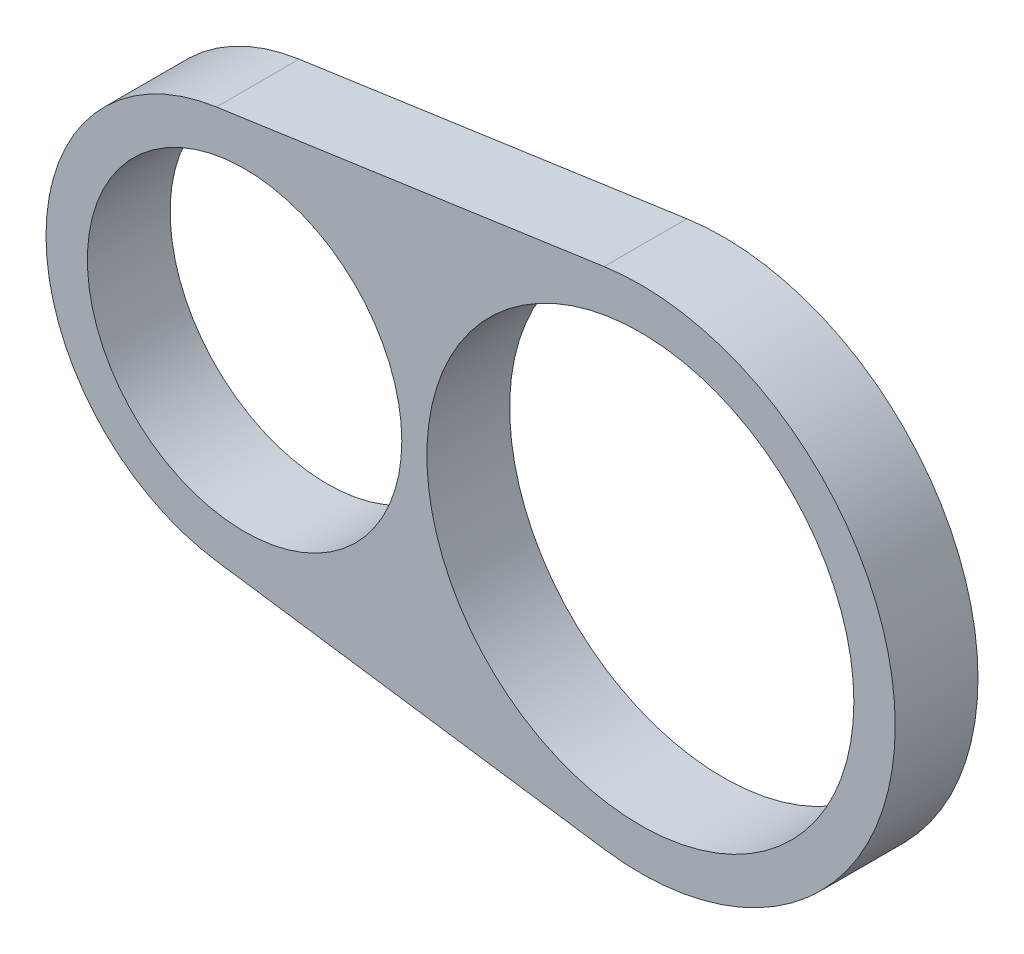
ISO-10303-21;
HEADER;
FILE_DESCRIPTION(('STEP AP214'),'2;1');
FILE_NAME('part.step','',(''),(''),'','','');
FILE_SCHEMA(('AUTOMOTIVE_DESIGN { 1 0 10303 214 1 1 1 1 }'));
ENDSEC;
DATA;
#1=APPLICATION_CONTEXT('core data for automotive mechanical design processes');
#2=APPLICATION_PROTOCOL_DEFINITION('international standard','automotive_design',2000,#1);
#3=PRODUCT_CONTEXT('',#1,'mechanical');
#4=PRODUCT('Part','Part','',(#3));
#5=PRODUCT_RELATED_PRODUCT_CATEGORY('part','',(#4));
#6=PRODUCT_DEFINITION_FORMATION('','',#4);
#7=PRODUCT_DEFINITION_CONTEXT('part definition',#1,'design');
#8=PRODUCT_DEFINITION('design','',#6,#7);
#9=PRODUCT_DEFINITION_SHAPE('','',#8);
#10=(LENGTH_UNIT() NAMED_UNIT(*) SI_UNIT(.MILLI.,.METRE.));
#11=(NAMED_UNIT(*) PLANE_ANGLE_UNIT() SI_UNIT($,.RADIAN.));
#12=(NAMED_UNIT(*) SI_UNIT($,.STERADIAN.) SOLID_ANGLE_UNIT());
#13=UNCERTAINTY_MEASURE_WITH_UNIT(LENGTH_MEASURE(1.E-05),#10,'distance_accuracy_value','');
#14=(GEOMETRIC_REPRESENTATION_CONTEXT(3) GLOBAL_UNCERTAINTY_ASSIGNED_CONTEXT((#13)) GLOBAL_UNIT_ASSIGNED_CONTEXT((#10,
#11,#12)) REPRESENTATION_CONTEXT('',''));
#15=CARTESIAN_POINT('',(0.,0.,0.));
#16=DIRECTION('',(0.,0.,1.));
#17=DIRECTION('',(1.,0.,0.));
#18=AXIS2_PLACEMENT_3D('',#15,#16,#17);
#19=CARTESIAN_POINT('',(-23.915,0.,10.));
#20=DIRECTION('',(0.,0.,1.));
#21=DIRECTION('',(1.,0.,0.));
#22=AXIS2_PLACEMENT_3D('',#19,#20,#21);
#23=PLANE('',#22);
#24=CARTESIAN_POINT('',(23.915,0.,10.));
#25=DIRECTION('',(0.,0.,1.));
#26=DIRECTION('',(1.,0.,0.));
#27=AXIS2_PLACEMENT_3D('',#24,#25,#26);
#28=CIRCLE('',#27,25.8);
#29=CARTESIAN_POINT('',(49.715,0.,10.));
#30=VERTEX_POINT('',#29);
#31=EDGE_CURVE('E101',#30,#30,#28,.T.);
#32=ORIENTED_EDGE('',*,*,#31,.F.);
#33=EDGE_LOOP('',(#32));
#34=FACE_BOUND('',#33,.T.);
#35=CARTESIAN_POINT('',(-23.915,0.,10.));
#36=DIRECTION('',(0.,0.,1.));
#37=DIRECTION('',(1.,0.,0.));
#38=AXIS2_PLACEMENT_3D('',#35,#36,#37);
#39=CIRCLE('',#38,24.);
#40=CARTESIAN_POINT('',(-27.3270844658164,23.7562134945394,10.));
#41=VERTEX_POINT('',#40);
#42=CARTESIAN_POINT('',(-27.3270844658164,-23.7562134945394,10.));
#43=VERTEX_POINT('',#42);
#44=EDGE_CURVE('E86',#41,#43,#39,.T.);
#45=ORIENTED_EDGE('',*,*,#44,.T.);
#46=DIRECTION('',(0.98984222893914,-0.142170186075684,0.));
#47=VECTOR('',#46,1.);
#48=CARTESIAN_POINT('',(-27.3270844658164,-23.7562134945394,10.));
#49=LINE('',#48,#47);
#50=CARTESIAN_POINT('',(19.5361582688689,-30.4871406513255,10.));
#51=VERTEX_POINT('',#50);
#52=EDGE_CURVE('E81',#43,#51,#49,.T.);
#53=ORIENTED_EDGE('',*,*,#52,.T.);
#54=CARTESIAN_POINT('',(23.915,0.,10.));
#55=DIRECTION('',(0.,0.,1.));
#56=DIRECTION('',(1.,0.,0.));
#57=AXIS2_PLACEMENT_3D('',#54,#55,#56);
#58=CIRCLE('',#57,30.8);
#59=CARTESIAN_POINT('',(19.5361582688689,30.4871406513255,10.));
#60=VERTEX_POINT('',#59);
#61=EDGE_CURVE('E84',#51,#60,#58,.T.);
#62=ORIENTED_EDGE('',*,*,#61,.T.);
#63=DIRECTION('',(-0.98984222893914,-0.142170186075685,0.));
#64=VECTOR('',#63,1.);
#65=CARTESIAN_POINT('',(19.5361582688689,30.4871406513255,10.));
#66=LINE('',#65,#64);
#67=EDGE_CURVE('E51',#60,#41,#66,.T.);
#68=ORIENTED_EDGE('',*,*,#67,.T.);
#69=EDGE_LOOP('',(#45,#53,#62,#68));
#70=FACE_BOUND('',#69,.T.);
#71=CARTESIAN_POINT('',(-23.915,0.,10.));
#72=DIRECTION('',(0.,0.,1.));
#73=DIRECTION('',(1.,0.,0.));
#74=AXIS2_PLACEMENT_3D('',#71,#72,#73);
#75=CIRCLE('',#74,19.);
#76=CARTESIAN_POINT('',(-4.915,0.,10.));
#77=VERTEX_POINT('',#76);
#78=EDGE_CURVE('E116',#77,#77,#75,.T.);
#79=ORIENTED_EDGE('',*,*,#78,.F.);
#80=EDGE_LOOP('',(#79));
#81=FACE_BOUND('',#80,.T.);
#82=ADVANCED_FACE('F34',(#34,#70,#81),#23,.T.);
#83=CARTESIAN_POINT('',(-23.915,0.,0.));
#84=DIRECTION('',(0.,0.,1.));
#85=DIRECTION('',(1.,0.,0.));
#86=AXIS2_PLACEMENT_3D('',#83,#84,#85);
#87=PLANE('',#86);
#88=CARTESIAN_POINT('',(-23.915,0.,0.));
#89=DIRECTION('',(0.,0.,1.));
#90=DIRECTION('',(1.,0.,0.));
#91=AXIS2_PLACEMENT_3D('',#88,#89,#90);
#92=CIRCLE('',#91,24.);
#93=CARTESIAN_POINT('',(-27.3270844658164,23.7562134945394,0.));
#94=VERTEX_POINT('',#93);
#95=CARTESIAN_POINT('',(-27.3270844658164,-23.7562134945394,0.));
#96=VERTEX_POINT('',#95);
#97=EDGE_CURVE('E98',#94,#96,#92,.T.);
#98=ORIENTED_EDGE('',*,*,#97,.F.);
#99=DIRECTION('',(-0.98984222893914,-0.142170186075685,0.));
#100=VECTOR('',#99,1.);
#101=CARTESIAN_POINT('',(19.5361582688689,30.4871406513255,0.));
#102=LINE('',#101,#100);
#103=CARTESIAN_POINT('',(19.5361582688689,30.4871406513255,0.));
#104=VERTEX_POINT('',#103);
#105=EDGE_CURVE('E74',#104,#94,#102,.T.);
#106=ORIENTED_EDGE('',*,*,#105,.F.);
#107=CARTESIAN_POINT('',(23.915,0.,0.));
#108=DIRECTION('',(0.,0.,1.));
#109=DIRECTION('',(1.,0.,0.));
#110=AXIS2_PLACEMENT_3D('',#107,#108,#109);
#111=CIRCLE('',#110,30.8);
#112=CARTESIAN_POINT('',(19.5361582688689,-30.4871406513255,0.));
#113=VERTEX_POINT('',#112);
#114=EDGE_CURVE('E68',#113,#104,#111,.T.);
#115=ORIENTED_EDGE('',*,*,#114,.F.);
#116=DIRECTION('',(0.98984222893914,-0.142170186075684,0.));
#117=VECTOR('',#116,1.);
#118=CARTESIAN_POINT('',(-27.3270844658164,-23.7562134945394,0.));
#119=LINE('',#118,#117);
#120=EDGE_CURVE('E90',#96,#113,#119,.T.);
#121=ORIENTED_EDGE('',*,*,#120,.F.);
#122=EDGE_LOOP('',(#98,#106,#115,#121));
#123=FACE_BOUND('',#122,.T.);
#124=CARTESIAN_POINT('',(23.915,0.,0.));
#125=DIRECTION('',(0.,0.,1.));
#126=DIRECTION('',(1.,0.,0.));
#127=AXIS2_PLACEMENT_3D('',#124,#125,#126);
#128=CIRCLE('',#127,25.8);
#129=CARTESIAN_POINT('',(49.715,0.,0.));
#130=VERTEX_POINT('',#129);
#131=EDGE_CURVE('E113',#130,#130,#128,.T.);
#132=ORIENTED_EDGE('',*,*,#131,.T.);
#133=EDGE_LOOP('',(#132));
#134=FACE_BOUND('',#133,.T.);
#135=CARTESIAN_POINT('',(-23.915,0.,0.));
#136=DIRECTION('',(0.,0.,1.));
#137=DIRECTION('',(1.,0.,0.));
#138=AXIS2_PLACEMENT_3D('',#135,#136,#137);
#139=CIRCLE('',#138,19.);
#140=CARTESIAN_POINT('',(-4.915,0.,0.));
#141=VERTEX_POINT('',#140);
#142=EDGE_CURVE('E119',#141,#141,#139,.T.);
#143=ORIENTED_EDGE('',*,*,#142,.T.);
#144=EDGE_LOOP('',(#143));
#145=FACE_BOUND('',#144,.T.);
#146=ADVANCED_FACE('F109',(#123,#134,#145),#87,.F.);
#147=CARTESIAN_POINT('',(-23.915,0.,10.));
#148=DIRECTION('',(0.,0.,-1.));
#149=DIRECTION('',(-1.,0.,0.));
#150=AXIS2_PLACEMENT_3D('',#147,#148,#149);
#151=CYLINDRICAL_SURFACE('',#150,24.);
#152=ORIENTED_EDGE('',*,*,#97,.T.);
#153=DIRECTION('',(0.,0.,-1.));
#154=VECTOR('',#153,1.);
#155=CARTESIAN_POINT('',(-27.3270844658164,-23.7562134945394,10.));
#156=LINE('',#155,#154);
#157=EDGE_CURVE('E11',#43,#96,#156,.T.);
#158=ORIENTED_EDGE('',*,*,#157,.F.);
#159=ORIENTED_EDGE('',*,*,#44,.F.);
#160=DIRECTION('',(0.,0.,-1.));
#161=VECTOR('',#160,1.);
#162=CARTESIAN_POINT('',(-27.3270844658164,23.7562134945394,10.));
#163=LINE('',#162,#161);
#164=EDGE_CURVE('E94',#41,#94,#163,.T.);
#165=ORIENTED_EDGE('',*,*,#164,.T.);
#166=EDGE_LOOP('',(#152,#158,#159,#165));
#167=FACE_BOUND('',#166,.T.);
#168=ADVANCED_FACE('F36',(#167),#151,.T.);
#169=CARTESIAN_POINT('',(-27.3270844658164,-23.7562134945394,10.));
#170=DIRECTION('',(0.142170186075684,0.98984222893914,0.));
#171=DIRECTION('',(-0.98984222893914,0.142170186075684,0.));
#172=AXIS2_PLACEMENT_3D('',#169,#170,#171);
#173=PLANE('',#172);
#174=ORIENTED_EDGE('',*,*,#120,.T.);
#175=DIRECTION('',(0.,0.,-1.));
#176=VECTOR('',#175,1.);
#177=CARTESIAN_POINT('',(19.5361582688689,-30.4871406513255,10.));
#178=LINE('',#177,#176);
#179=EDGE_CURVE('E43',#51,#113,#178,.T.);
#180=ORIENTED_EDGE('',*,*,#179,.F.);
#181=ORIENTED_EDGE('',*,*,#52,.F.);
#182=ORIENTED_EDGE('',*,*,#157,.T.);
#183=EDGE_LOOP('',(#174,#180,#181,#182));
#184=FACE_BOUND('',#183,.T.);
#185=ADVANCED_FACE('F89',(#184),#173,.F.);
#186=CARTESIAN_POINT('',(23.915,0.,10.));
#187=DIRECTION('',(0.,0.,-1.));
#188=DIRECTION('',(-1.,0.,0.));
#189=AXIS2_PLACEMENT_3D('',#186,#187,#188);
#190=CYLINDRICAL_SURFACE('',#189,30.8);
#191=ORIENTED_EDGE('',*,*,#114,.T.);
#192=DIRECTION('',(0.,0.,-1.));
#193=VECTOR('',#192,1.);
#194=CARTESIAN_POINT('',(19.5361582688689,30.4871406513255,10.));
#195=LINE('',#194,#193);
#196=EDGE_CURVE('E91',#60,#104,#195,.T.);
#197=ORIENTED_EDGE('',*,*,#196,.F.);
#198=ORIENTED_EDGE('',*,*,#61,.F.);
#199=ORIENTED_EDGE('',*,*,#179,.T.);
#200=EDGE_LOOP('',(#191,#197,#198,#199));
#201=FACE_BOUND('',#200,.T.);
#202=ADVANCED_FACE('F92',(#201),#190,.T.);
#203=CARTESIAN_POINT('',(19.5361582688689,30.4871406513255,10.));
#204=DIRECTION('',(0.142170186075685,-0.98984222893914,0.));
#205=DIRECTION('',(0.98984222893914,0.142170186075685,0.));
#206=AXIS2_PLACEMENT_3D('',#203,#204,#205);
#207=PLANE('',#206);
#208=ORIENTED_EDGE('',*,*,#105,.T.);
#209=ORIENTED_EDGE('',*,*,#164,.F.);
#210=ORIENTED_EDGE('',*,*,#67,.F.);
#211=ORIENTED_EDGE('',*,*,#196,.T.);
#212=EDGE_LOOP('',(#208,#209,#210,#211));
#213=FACE_BOUND('',#212,.T.);
#214=ADVANCED_FACE('F106',(#213),#207,.F.);
#215=CARTESIAN_POINT('',(23.915,0.,10.));
#216=DIRECTION('',(0.,0.,-1.));
#217=DIRECTION('',(-1.,0.,0.));
#218=AXIS2_PLACEMENT_3D('',#215,#216,#217);
#219=CYLINDRICAL_SURFACE('',#218,25.8);
#220=ORIENTED_EDGE('',*,*,#31,.T.);
#221=EDGE_LOOP('',(#220));
#222=FACE_BOUND('',#221,.T.);
#223=ORIENTED_EDGE('',*,*,#131,.F.);
#224=EDGE_LOOP('',(#223));
#225=FACE_BOUND('',#224,.T.);
#226=ADVANCED_FACE('F136',(#222,#225),#219,.F.);
#227=CARTESIAN_POINT('',(-23.915,0.,10.));
#228=DIRECTION('',(0.,0.,-1.));
#229=DIRECTION('',(-1.,0.,0.));
#230=AXIS2_PLACEMENT_3D('',#227,#228,#229);
#231=CYLINDRICAL_SURFACE('',#230,19.);
#232=ORIENTED_EDGE('',*,*,#78,.T.);
#233=EDGE_LOOP('',(#232));
#234=FACE_BOUND('',#233,.T.);
#235=ORIENTED_EDGE('',*,*,#142,.F.);
#236=EDGE_LOOP('',(#235));
#237=FACE_BOUND('',#236,.T.);
#238=ADVANCED_FACE('F125',(#234,#237),#231,.F.);
#239=CLOSED_SHELL('',(#82,#146,#168,#185,#202,#214,#226,#238));
#240=MANIFOLD_SOLID_BREP('B2',#239);
#241=ADVANCED_BREP_SHAPE_REPRESENTATION('',(#18,#240),#14);
#242=SHAPE_DEFINITION_REPRESENTATION(#9,#241);
ENDSEC;
END-ISO-10303-21;
